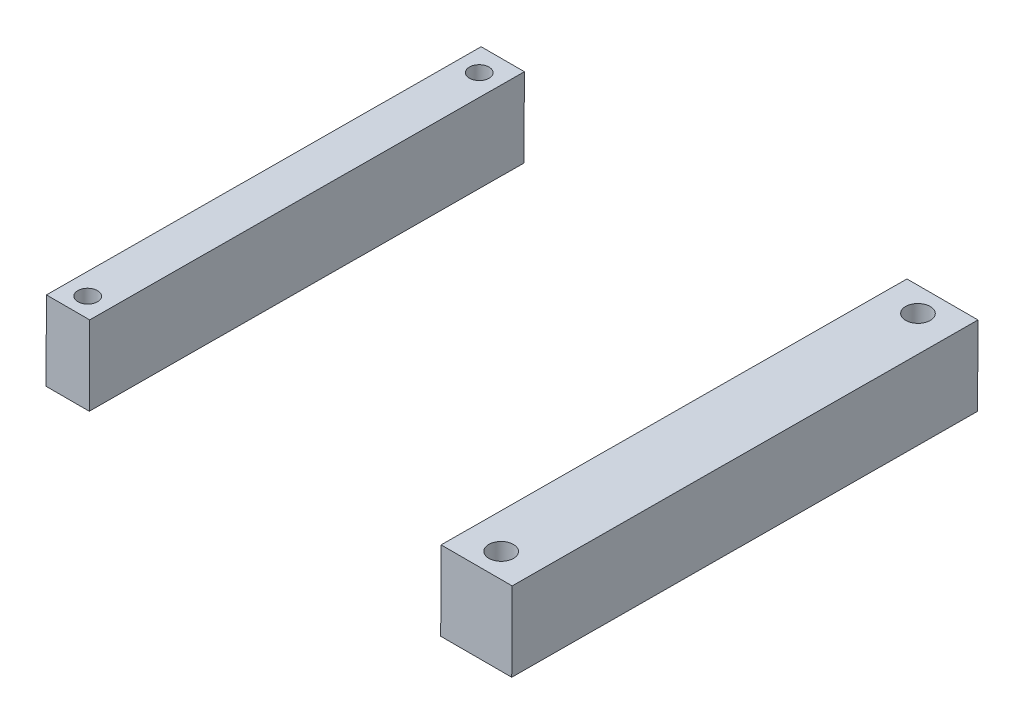
ISO-10303-21;
HEADER;
FILE_DESCRIPTION(('STEP AP214'),'2;1');
FILE_NAME('part.step','',(''),(''),'','','');
FILE_SCHEMA(('AUTOMOTIVE_DESIGN { 1 0 10303 214 1 1 1 1 }'));
ENDSEC;
DATA;
#1=APPLICATION_CONTEXT('core data for automotive mechanical design processes');
#2=APPLICATION_PROTOCOL_DEFINITION('international standard','automotive_design',2000,#1);
#3=PRODUCT_CONTEXT('',#1,'mechanical');
#4=PRODUCT('Part','Part','',(#3));
#5=PRODUCT_RELATED_PRODUCT_CATEGORY('part','',(#4));
#6=PRODUCT_DEFINITION_FORMATION('','',#4);
#7=PRODUCT_DEFINITION_CONTEXT('part definition',#1,'design');
#8=PRODUCT_DEFINITION('design','',#6,#7);
#9=PRODUCT_DEFINITION_SHAPE('','',#8);
#10=(LENGTH_UNIT() NAMED_UNIT(*) SI_UNIT(.MILLI.,.METRE.));
#11=(NAMED_UNIT(*) PLANE_ANGLE_UNIT() SI_UNIT($,.RADIAN.));
#12=(NAMED_UNIT(*) SI_UNIT($,.STERADIAN.) SOLID_ANGLE_UNIT());
#13=UNCERTAINTY_MEASURE_WITH_UNIT(LENGTH_MEASURE(1.E-05),#10,'distance_accuracy_value','');
#14=(GEOMETRIC_REPRESENTATION_CONTEXT(3) GLOBAL_UNCERTAINTY_ASSIGNED_CONTEXT((#13)) GLOBAL_UNIT_ASSIGNED_CONTEXT((#10,
#11,#12)) REPRESENTATION_CONTEXT('',''));
#15=CARTESIAN_POINT('',(0.,0.,0.));
#16=DIRECTION('',(0.,0.,1.));
#17=DIRECTION('',(1.,0.,0.));
#18=AXIS2_PLACEMENT_3D('',#15,#16,#17);
#19=CARTESIAN_POINT('',(0.,325.481791177383,-1.81138531546685));
#20=DIRECTION('',(0.,0.99998451439394,-0.0055651569893207));
#21=DIRECTION('',(0.,0.0055651569893207,0.99998451439394));
#22=AXIS2_PLACEMENT_3D('',#19,#20,#21);
#23=PLANE('',#22);
#24=CARTESIAN_POINT('',(-69.4999999998664,319.832234200687,-1016.96145219099));
#25=DIRECTION('',(0.,0.99998451439394,-0.00556515698932075));
#26=DIRECTION('',(0.,0.00556515698932075,0.99998451439394));
#27=AXIS2_PLACEMENT_3D('',#24,#25,#26);
#28=CIRCLE('',#27,3.17500000000019);
#29=CARTESIAN_POINT('',(-69.4999999998664,319.814564827246,-1020.13640302419));
#30=VERTEX_POINT('',#29);
#31=EDGE_CURVE('E118',#30,#30,#28,.T.);
#32=ORIENTED_EDGE('',*,*,#31,.F.);
#33=EDGE_LOOP('',(#32));
#34=FACE_BOUND('',#33,.T.);
#35=DIRECTION('',(0.,0.0055651569893207,0.99998451439394));
#36=VECTOR('',#35,1.);
#37=CARTESIAN_POINT('',(-76.4999999998666,319.789827704428,-1024.58133419067));
#38=LINE('',#37,#36);
#39=CARTESIAN_POINT('',(-76.4999999998666,319.789827704428,-1024.58133419067));
#40=VERTEX_POINT('',#39);
#41=CARTESIAN_POINT('',(-76.4999999998666,320.572998735481,-883.855941416111));
#42=VERTEX_POINT('',#41);
#43=EDGE_CURVE('E111',#40,#42,#38,.T.);
#44=ORIENTED_EDGE('',*,*,#43,.T.);
#45=DIRECTION('',(1.,0.,0.));
#46=VECTOR('',#45,1.);
#47=CARTESIAN_POINT('',(-76.4999999998666,320.572998735481,-883.855941416111));
#48=LINE('',#47,#46);
#49=CARTESIAN_POINT('',(-62.4999999998668,320.572998735481,-883.855941416111));
#50=VERTEX_POINT('',#49);
#51=EDGE_CURVE('E80',#42,#50,#48,.T.);
#52=ORIENTED_EDGE('',*,*,#51,.T.);
#53=DIRECTION('',(0.,-0.0055651569893207,-0.99998451439394));
#54=VECTOR('',#53,1.);
#55=CARTESIAN_POINT('',(-62.4999999998668,319.789827704428,-1024.58133419067));
#56=LINE('',#55,#54);
#57=CARTESIAN_POINT('',(-62.4999999998668,319.789827704428,-1024.58133419067));
#58=VERTEX_POINT('',#57);
#59=EDGE_CURVE('E120',#50,#58,#56,.T.);
#60=ORIENTED_EDGE('',*,*,#59,.T.);
#61=DIRECTION('',(-1.,0.,0.));
#62=VECTOR('',#61,1.);
#63=CARTESIAN_POINT('',(-76.4999999998666,319.789827704428,-1024.58133419067));
#64=LINE('',#63,#62);
#65=EDGE_CURVE('E104',#58,#40,#64,.T.);
#66=ORIENTED_EDGE('',*,*,#65,.T.);
#67=EDGE_LOOP('',(#44,#52,#60,#66));
#68=FACE_BOUND('',#67,.T.);
#69=CARTESIAN_POINT('',(-69.4999999998664,320.537659988599,-890.205843082512));
#70=DIRECTION('',(0.,0.99998451439394,-0.00556515698932075));
#71=DIRECTION('',(0.,0.00556515698932075,0.99998451439394));
#72=AXIS2_PLACEMENT_3D('',#69,#70,#71);
#73=CIRCLE('',#72,3.17500000000008);
#74=CARTESIAN_POINT('',(-69.4999999998664,320.519990615157,-893.380793915713));
#75=VERTEX_POINT('',#74);
#76=EDGE_CURVE('E51',#75,#75,#73,.T.);
#77=ORIENTED_EDGE('',*,*,#76,.F.);
#78=EDGE_LOOP('',(#77));
#79=FACE_BOUND('',#78,.T.);
#80=ADVANCED_FACE('F47',(#34,#68,#79),#23,.T.);
#81=CARTESIAN_POINT('',(0.,299.932186834617,-1.66919555438971));
#82=DIRECTION('',(0.,0.99998451439394,-0.0055651569893207));
#83=DIRECTION('',(0.,0.0055651569893207,0.99998451439394));
#84=AXIS2_PLACEMENT_3D('',#81,#82,#83);
#85=PLANE('',#84);
#86=DIRECTION('',(0.,0.0055651569893207,0.99998451439394));
#87=VECTOR('',#86,1.);
#88=CARTESIAN_POINT('',(-76.4999999998666,294.240223361663,-1024.43914442959));
#89=LINE('',#88,#87);
#90=CARTESIAN_POINT('',(-76.4999999998666,294.240223361663,-1024.43914442959));
#91=VERTEX_POINT('',#90);
#92=CARTESIAN_POINT('',(-76.4999999998666,295.023394392716,-883.713751655034));
#93=VERTEX_POINT('',#92);
#94=EDGE_CURVE('E110',#91,#93,#89,.T.);
#95=ORIENTED_EDGE('',*,*,#94,.F.);
#96=DIRECTION('',(-1.,0.,0.));
#97=VECTOR('',#96,1.);
#98=CARTESIAN_POINT('',(-76.4999999998666,294.240223361663,-1024.43914442959));
#99=LINE('',#98,#97);
#100=CARTESIAN_POINT('',(-62.4999999998668,294.240223361663,-1024.43914442959));
#101=VERTEX_POINT('',#100);
#102=EDGE_CURVE('E90',#101,#91,#99,.T.);
#103=ORIENTED_EDGE('',*,*,#102,.F.);
#104=DIRECTION('',(0.,-0.0055651569893207,-0.99998451439394));
#105=VECTOR('',#104,1.);
#106=CARTESIAN_POINT('',(-62.4999999998668,294.240223361663,-1024.43914442959));
#107=LINE('',#106,#105);
#108=CARTESIAN_POINT('',(-62.4999999998668,295.023394392716,-883.713751655034));
#109=VERTEX_POINT('',#108);
#110=EDGE_CURVE('E96',#109,#101,#107,.T.);
#111=ORIENTED_EDGE('',*,*,#110,.F.);
#112=DIRECTION('',(1.,0.,0.));
#113=VECTOR('',#112,1.);
#114=CARTESIAN_POINT('',(-76.4999999998666,295.023394392716,-883.713751655034));
#115=LINE('',#114,#113);
#116=EDGE_CURVE('E64',#93,#109,#115,.T.);
#117=ORIENTED_EDGE('',*,*,#116,.F.);
#118=EDGE_LOOP('',(#95,#103,#111,#117));
#119=FACE_BOUND('',#118,.T.);
#120=CARTESIAN_POINT('',(-69.4999999998664,294.282629857922,-1016.81926242991));
#121=DIRECTION('',(0.,0.99998451439394,-0.00556515698932075));
#122=DIRECTION('',(0.,0.00556515698932075,0.99998451439394));
#123=AXIS2_PLACEMENT_3D('',#120,#121,#122);
#124=CIRCLE('',#123,3.17500000000019);
#125=CARTESIAN_POINT('',(-69.4999999998664,294.264960484481,-1019.99421326311));
#126=VERTEX_POINT('',#125);
#127=EDGE_CURVE('E123',#126,#126,#124,.T.);
#128=ORIENTED_EDGE('',*,*,#127,.T.);
#129=EDGE_LOOP('',(#128));
#130=FACE_BOUND('',#129,.T.);
#131=CARTESIAN_POINT('',(-69.4999999998664,294.988055645833,-890.063653321435));
#132=DIRECTION('',(0.,0.99998451439394,-0.00556515698932075));
#133=DIRECTION('',(0.,0.00556515698932075,0.99998451439394));
#134=AXIS2_PLACEMENT_3D('',#131,#132,#133);
#135=CIRCLE('',#134,3.17500000000008);
#136=CARTESIAN_POINT('',(-69.4999999998664,294.970386272392,-893.238604154636));
#137=VERTEX_POINT('',#136);
#138=EDGE_CURVE('E12',#137,#137,#135,.T.);
#139=ORIENTED_EDGE('',*,*,#138,.T.);
#140=EDGE_LOOP('',(#139));
#141=FACE_BOUND('',#140,.T.);
#142=ADVANCED_FACE('F107',(#119,#130,#141),#85,.F.);
#143=CARTESIAN_POINT('',(-76.4999999998666,319.789827704428,-1024.58133419067));
#144=DIRECTION('',(1.,0.,0.));
#145=DIRECTION('',(0.,1.,0.));
#146=AXIS2_PLACEMENT_3D('',#143,#144,#145);
#147=PLANE('',#146);
#148=ORIENTED_EDGE('',*,*,#94,.T.);
#149=DIRECTION('',(0.,-0.99998451439394,0.00556515698932075));
#150=VECTOR('',#149,1.);
#151=CARTESIAN_POINT('',(-76.4999999998666,320.572998735481,-883.855941416111));
#152=LINE('',#151,#150);
#153=EDGE_CURVE('E168',#42,#93,#152,.T.);
#154=ORIENTED_EDGE('',*,*,#153,.F.);
#155=ORIENTED_EDGE('',*,*,#43,.F.);
#156=DIRECTION('',(0.,-0.99998451439394,0.00556515698932075));
#157=VECTOR('',#156,1.);
#158=CARTESIAN_POINT('',(-76.4999999998666,319.789827704428,-1024.58133419067));
#159=LINE('',#158,#157);
#160=EDGE_CURVE('E105',#40,#91,#159,.T.);
#161=ORIENTED_EDGE('',*,*,#160,.T.);
#162=EDGE_LOOP('',(#148,#154,#155,#161));
#163=FACE_BOUND('',#162,.T.);
#164=ADVANCED_FACE('F145',(#163),#147,.F.);
#165=CARTESIAN_POINT('',(-76.4999999998666,320.572998735481,-883.855941416111));
#166=DIRECTION('',(0.,-0.00556515698932075,-0.99998451439394));
#167=DIRECTION('',(0.,0.99998451439394,-0.00556515698932075));
#168=AXIS2_PLACEMENT_3D('',#165,#166,#167);
#169=PLANE('',#168);
#170=ORIENTED_EDGE('',*,*,#116,.T.);
#171=DIRECTION('',(0.,-0.99998451439394,0.00556515698932075));
#172=VECTOR('',#171,1.);
#173=CARTESIAN_POINT('',(-62.4999999998668,320.572998735481,-883.855941416111));
#174=LINE('',#173,#172);
#175=EDGE_CURVE('E101',#50,#109,#174,.T.);
#176=ORIENTED_EDGE('',*,*,#175,.F.);
#177=ORIENTED_EDGE('',*,*,#51,.F.);
#178=ORIENTED_EDGE('',*,*,#153,.T.);
#179=EDGE_LOOP('',(#170,#176,#177,#178));
#180=FACE_BOUND('',#179,.T.);
#181=ADVANCED_FACE('F150',(#180),#169,.F.);
#182=CARTESIAN_POINT('',(-62.4999999998668,319.789827704428,-1024.58133419067));
#183=DIRECTION('',(-1.,0.,0.));
#184=DIRECTION('',(0.,-1.,0.));
#185=AXIS2_PLACEMENT_3D('',#182,#183,#184);
#186=PLANE('',#185);
#187=ORIENTED_EDGE('',*,*,#110,.T.);
#188=DIRECTION('',(0.,-0.99998451439394,0.00556515698932075));
#189=VECTOR('',#188,1.);
#190=CARTESIAN_POINT('',(-62.4999999998668,319.789827704428,-1024.58133419067));
#191=LINE('',#190,#189);
#192=EDGE_CURVE('E99',#58,#101,#191,.T.);
#193=ORIENTED_EDGE('',*,*,#192,.F.);
#194=ORIENTED_EDGE('',*,*,#59,.F.);
#195=ORIENTED_EDGE('',*,*,#175,.T.);
#196=EDGE_LOOP('',(#187,#193,#194,#195));
#197=FACE_BOUND('',#196,.T.);
#198=ADVANCED_FACE('F97',(#197),#186,.F.);
#199=CARTESIAN_POINT('',(-76.4999999998666,319.789827704428,-1024.58133419067));
#200=DIRECTION('',(0.,0.00556515698932075,0.99998451439394));
#201=DIRECTION('',(0.,-0.99998451439394,0.00556515698932075));
#202=AXIS2_PLACEMENT_3D('',#199,#200,#201);
#203=PLANE('',#202);
#204=ORIENTED_EDGE('',*,*,#102,.T.);
#205=ORIENTED_EDGE('',*,*,#160,.F.);
#206=ORIENTED_EDGE('',*,*,#65,.F.);
#207=ORIENTED_EDGE('',*,*,#192,.T.);
#208=EDGE_LOOP('',(#204,#205,#206,#207));
#209=FACE_BOUND('',#208,.T.);
#210=ADVANCED_FACE('F103',(#209),#203,.F.);
#211=CARTESIAN_POINT('',(-69.4999999998664,319.832234200687,-1016.96145219099));
#212=DIRECTION('',(0.,-0.99998451439394,0.00556515698932075));
#213=DIRECTION('',(0.,-0.00556515698932075,-0.99998451439394));
#214=AXIS2_PLACEMENT_3D('',#211,#212,#213);
#215=CYLINDRICAL_SURFACE('',#214,3.17500000000019);
#216=CARTESIAN_POINT('',(-69.4999999998664,319.814564827246,-1020.13640302419));
#217=CARTESIAN_POINT('',(-69.4999999998664,319.548423115342,-1020.13492188084));
#218=CARTESIAN_POINT('',(-69.4999999998664,319.282281403438,-1020.1334407375));
#219=CARTESIAN_POINT('',(-69.4999999998664,318.749997979631,-1020.13047845081));
#220=CARTESIAN_POINT('',(-69.4999999998664,318.483856267727,-1020.12899730747));
#221=CARTESIAN_POINT('',(-69.4999999998664,317.951572843919,-1020.12603502078));
#222=CARTESIAN_POINT('',(-69.4999999998664,317.685431132016,-1020.12455387743));
#223=CARTESIAN_POINT('',(-69.4999999998664,317.153147708208,-1020.12159159074));
#224=CARTESIAN_POINT('',(-69.4999999998664,316.887005996304,-1020.1201104474));
#225=CARTESIAN_POINT('',(-69.4999999998664,316.354722572497,-1020.11714816071));
#226=CARTESIAN_POINT('',(-69.4999999998664,316.088580860593,-1020.11566701736));
#227=CARTESIAN_POINT('',(-69.4999999998664,315.556297436785,-1020.11270473068));
#228=CARTESIAN_POINT('',(-69.4999999998664,315.290155724881,-1020.11122358733));
#229=CARTESIAN_POINT('',(-69.4999999998664,314.757872301074,-1020.10826130064));
#230=CARTESIAN_POINT('',(-69.4999999998664,314.49173058917,-1020.1067801573));
#231=CARTESIAN_POINT('',(-69.4999999998664,313.959447165362,-1020.10381787061));
#232=CARTESIAN_POINT('',(-69.4999999998664,313.693305453459,-1020.10233672726));
#233=CARTESIAN_POINT('',(-69.4999999998664,313.161022029651,-1020.09937444057));
#234=CARTESIAN_POINT('',(-69.4999999998664,312.894880317747,-1020.09789329723));
#235=CARTESIAN_POINT('',(-69.4999999998664,312.362596893939,-1020.09493101054));
#236=CARTESIAN_POINT('',(-69.4999999998664,312.096455182036,-1020.0934498672));
#237=CARTESIAN_POINT('',(-69.4999999998664,311.564171758228,-1020.09048758051));
#238=CARTESIAN_POINT('',(-69.4999999998664,311.298030046324,-1020.08900643716));
#239=CARTESIAN_POINT('',(-69.4999999998664,310.765746622517,-1020.08604415047));
#240=CARTESIAN_POINT('',(-69.4999999998664,310.499604910613,-1020.08456300713));
#241=CARTESIAN_POINT('',(-69.4999999998664,309.967321486805,-1020.08160072044));
#242=CARTESIAN_POINT('',(-69.4999999998664,309.701179774901,-1020.0801195771));
#243=CARTESIAN_POINT('',(-69.4999999998664,309.168896351094,-1020.07715729041));
#244=CARTESIAN_POINT('',(-69.4999999998664,308.90275463919,-1020.07567614706));
#245=CARTESIAN_POINT('',(-69.4999999998664,308.370471215382,-1020.07271386037));
#246=CARTESIAN_POINT('',(-69.4999999998664,308.104329503479,-1020.07123271703));
#247=CARTESIAN_POINT('',(-69.4999999998664,307.572046079671,-1020.06827043034));
#248=CARTESIAN_POINT('',(-69.4999999998664,307.305904367767,-1020.06678928699));
#249=CARTESIAN_POINT('',(-69.4999999998664,306.77362094396,-1020.06382700031));
#250=CARTESIAN_POINT('',(-69.4999999998664,306.507479232056,-1020.06234585696));
#251=CARTESIAN_POINT('',(-69.4999999998664,305.975195808248,-1020.05938357027));
#252=CARTESIAN_POINT('',(-69.4999999998664,305.709054096344,-1020.05790242693));
#253=CARTESIAN_POINT('',(-69.4999999998664,305.176770672537,-1020.05494014024));
#254=CARTESIAN_POINT('',(-69.4999999998664,304.910628960633,-1020.05345899689));
#255=CARTESIAN_POINT('',(-69.4999999998664,304.378345536825,-1020.0504967102));
#256=CARTESIAN_POINT('',(-69.4999999998664,304.112203824922,-1020.04901556686));
#257=CARTESIAN_POINT('',(-69.4999999998664,303.579920401114,-1020.04605328017));
#258=CARTESIAN_POINT('',(-69.4999999998664,303.31377868921,-1020.04457213683));
#259=CARTESIAN_POINT('',(-69.4999999998664,302.781495265403,-1020.04160985014));
#260=CARTESIAN_POINT('',(-69.4999999998664,302.515353553499,-1020.04012870679));
#261=CARTESIAN_POINT('',(-69.4999999998664,301.983070129691,-1020.0371664201));
#262=CARTESIAN_POINT('',(-69.4999999998664,301.716928417787,-1020.03568527676));
#263=CARTESIAN_POINT('',(-69.4999999998664,301.18464499398,-1020.03272299007));
#264=CARTESIAN_POINT('',(-69.4999999998664,300.918503282076,-1020.03124184673));
#265=CARTESIAN_POINT('',(-69.4999999998664,300.386219858268,-1020.02827956004));
#266=CARTESIAN_POINT('',(-69.4999999998664,300.120078146365,-1020.02679841669));
#267=CARTESIAN_POINT('',(-69.4999999998664,299.587794722557,-1020.02383613));
#268=CARTESIAN_POINT('',(-69.4999999998664,299.321653010653,-1020.02235498666));
#269=CARTESIAN_POINT('',(-69.4999999998664,298.789369586846,-1020.01939269997));
#270=CARTESIAN_POINT('',(-69.4999999998664,298.523227874942,-1020.01791155662));
#271=CARTESIAN_POINT('',(-69.4999999998664,297.990944451134,-1020.01494926993));
#272=CARTESIAN_POINT('',(-69.4999999998664,297.72480273923,-1020.01346812659));
#273=CARTESIAN_POINT('',(-69.4999999998664,297.192519315423,-1020.0105058399));
#274=CARTESIAN_POINT('',(-69.4999999998664,296.926377603519,-1020.00902469656));
#275=CARTESIAN_POINT('',(-69.4999999998664,296.394094179711,-1020.00606240987));
#276=CARTESIAN_POINT('',(-69.4999999998664,296.127952467807,-1020.00458126652));
#277=CARTESIAN_POINT('',(-69.4999999998664,295.595669044,-1020.00161897983));
#278=CARTESIAN_POINT('',(-69.4999999998664,295.329527332096,-1020.00013783649));
#279=CARTESIAN_POINT('',(-69.4999999998664,294.797243908288,-1019.9971755498));
#280=CARTESIAN_POINT('',(-69.4999999998664,294.531102196385,-1019.99569440646));
#281=CARTESIAN_POINT('',(-69.4999999998664,294.264960484481,-1019.99421326311));
#282=B_SPLINE_CURVE_WITH_KNOTS('',3,(#216,#217,#218,#219,#220,#221,#222,#223,#224,#225,#226,
#227,#228,#229,#230,#231,#232,#233,#234,#235,#236,#237,#238,#239,#240,#241,#242,#243,#244,#245,
#246,#247,#248,#249,#250,#251,#252,#253,#254,#255,#256,#257,#258,#259,#260,#261,#262,#263,#264,
#265,#266,#267,#268,#269,#270,#271,#272,#273,#274,#275,#276,#277,#278,#279,#280,#281),
.UNSPECIFIED.,.F.,.F.,(4,2,2,2,2,2,2,2,2,2,2,2,2,2,2,2,2,2,2,2,2,2,2,2,2,2,2,2,2,2,2,2,4),(0.,
0.798437499999967,1.59687499999999,2.39531249999996,3.19374999999998,3.99218749999994,
4.79062499999997,5.58906249999999,6.38749999999995,7.18593749999998,7.98437499999994,
8.78281249999997,9.58124999999999,10.3796875,11.178125,11.9765624999999,12.775,13.5734375,
14.371875,15.1703125,15.9687499999999,16.7671875,17.565625,18.3640625,19.1625,19.9609375,
20.759375,21.5578124999999,22.35625,23.1546875,23.953125,24.7515625,25.5499999999999),.UNSPECIFIED.);
#283=EDGE_CURVE('BSEAM129',#30,#126,#282,.T.);
#284=ORIENTED_EDGE('',*,*,#31,.T.);
#285=ORIENTED_EDGE('',*,*,#127,.F.);
#286=ORIENTED_EDGE('',*,*,#283,.T.);
#287=ORIENTED_EDGE('',*,*,#283,.F.);
#288=EDGE_LOOP('',(#284,#286,#285,#287));
#289=FACE_BOUND('',#288,.T.);
#290=ADVANCED_FACE('F129',(#289),#215,.F.);
#291=CARTESIAN_POINT('',(-69.4999999998664,320.537659988599,-890.205843082512));
#292=DIRECTION('',(0.,-0.99998451439394,0.00556515698932075));
#293=DIRECTION('',(0.,-0.00556515698932075,-0.99998451439394));
#294=AXIS2_PLACEMENT_3D('',#291,#292,#293);
#295=CYLINDRICAL_SURFACE('',#294,3.17500000000008);
#296=CARTESIAN_POINT('',(-69.4999999998664,320.519990615157,-893.380793915713));
#297=CARTESIAN_POINT('',(-69.4999999998664,320.253848903254,-893.379312772369));
#298=CARTESIAN_POINT('',(-69.4999999998664,319.98770719135,-893.377831629024));
#299=CARTESIAN_POINT('',(-69.4999999998664,319.455423767542,-893.374869342335));
#300=CARTESIAN_POINT('',(-69.4999999998664,319.189282055638,-893.37338819899));
#301=CARTESIAN_POINT('',(-69.4999999998664,318.656998631831,-893.370425912301));
#302=CARTESIAN_POINT('',(-69.4999999998664,318.390856919927,-893.368944768957));
#303=CARTESIAN_POINT('',(-69.4999999998664,317.858573496119,-893.365982482268));
#304=CARTESIAN_POINT('',(-69.4999999998664,317.592431784216,-893.364501338923));
#305=CARTESIAN_POINT('',(-69.4999999998664,317.060148360408,-893.361539052234));
#306=CARTESIAN_POINT('',(-69.4999999998664,316.794006648504,-893.36005790889));
#307=CARTESIAN_POINT('',(-69.4999999998664,316.261723224697,-893.3570956222));
#308=CARTESIAN_POINT('',(-69.4999999998664,315.995581512793,-893.355614478856));
#309=CARTESIAN_POINT('',(-69.4999999998664,315.463298088985,-893.352652192167));
#310=CARTESIAN_POINT('',(-69.4999999998664,315.197156377081,-893.351171048822));
#311=CARTESIAN_POINT('',(-69.4999999998664,314.664872953274,-893.348208762133));
#312=CARTESIAN_POINT('',(-69.4999999998664,314.39873124137,-893.346727618789));
#313=CARTESIAN_POINT('',(-69.4999999998664,313.866447817562,-893.343765332099));
#314=CARTESIAN_POINT('',(-69.4999999998664,313.600306105659,-893.342284188755));
#315=CARTESIAN_POINT('',(-69.4999999998664,313.068022681851,-893.339321902066));
#316=CARTESIAN_POINT('',(-69.4999999998664,312.801880969947,-893.337840758721));
#317=CARTESIAN_POINT('',(-69.4999999998664,312.26959754614,-893.334878472032));
#318=CARTESIAN_POINT('',(-69.4999999998664,312.003455834236,-893.333397328687));
#319=CARTESIAN_POINT('',(-69.4999999998664,311.471172410428,-893.330435041998));
#320=CARTESIAN_POINT('',(-69.4999999998664,311.205030698524,-893.328953898654));
#321=CARTESIAN_POINT('',(-69.4999999998664,310.672747274717,-893.325991611965));
#322=CARTESIAN_POINT('',(-69.4999999998664,310.406605562813,-893.32451046862));
#323=CARTESIAN_POINT('',(-69.4999999998664,309.874322139005,-893.321548181931));
#324=CARTESIAN_POINT('',(-69.4999999998664,309.608180427102,-893.320067038586));
#325=CARTESIAN_POINT('',(-69.4999999998664,309.075897003294,-893.317104751897));
#326=CARTESIAN_POINT('',(-69.4999999998664,308.80975529139,-893.315623608553));
#327=CARTESIAN_POINT('',(-69.4999999998664,308.277471867583,-893.312661321864));
#328=CARTESIAN_POINT('',(-69.4999999998664,308.011330155679,-893.311180178519));
#329=CARTESIAN_POINT('',(-69.4999999998664,307.479046731871,-893.30821789183));
#330=CARTESIAN_POINT('',(-69.4999999998664,307.212905019967,-893.306736748485));
#331=CARTESIAN_POINT('',(-69.4999999998664,306.68062159616,-893.303774461796));
#332=CARTESIAN_POINT('',(-69.4999999998664,306.414479884256,-893.302293318452));
#333=CARTESIAN_POINT('',(-69.4999999998664,305.882196460448,-893.299331031763));
#334=CARTESIAN_POINT('',(-69.4999999998664,305.616054748544,-893.297849888418));
#335=CARTESIAN_POINT('',(-69.4999999998664,305.083771324737,-893.294887601729));
#336=CARTESIAN_POINT('',(-69.4999999998664,304.817629612833,-893.293406458385));
#337=CARTESIAN_POINT('',(-69.4999999998664,304.285346189025,-893.290444171695));
#338=CARTESIAN_POINT('',(-69.4999999998664,304.019204477122,-893.288963028351));
#339=CARTESIAN_POINT('',(-69.4999999998664,303.486921053314,-893.286000741662));
#340=CARTESIAN_POINT('',(-69.4999999998664,303.22077934141,-893.284519598317));
#341=CARTESIAN_POINT('',(-69.4999999998664,302.688495917603,-893.281557311628));
#342=CARTESIAN_POINT('',(-69.4999999998664,302.422354205699,-893.280076168284));
#343=CARTESIAN_POINT('',(-69.4999999998664,301.890070781891,-893.277113881594));
#344=CARTESIAN_POINT('',(-69.4999999998664,301.623929069987,-893.27563273825));
#345=CARTESIAN_POINT('',(-69.4999999998664,301.09164564618,-893.272670451561));
#346=CARTESIAN_POINT('',(-69.4999999998664,300.825503934276,-893.271189308216));
#347=CARTESIAN_POINT('',(-69.4999999998664,300.293220510468,-893.268227021527));
#348=CARTESIAN_POINT('',(-69.4999999998664,300.027078798565,-893.266745878183));
#349=CARTESIAN_POINT('',(-69.4999999998664,299.494795374757,-893.263783591494));
#350=CARTESIAN_POINT('',(-69.4999999998664,299.228653662853,-893.262302448149));
#351=CARTESIAN_POINT('',(-69.4999999998664,298.696370239046,-893.25934016146));
#352=CARTESIAN_POINT('',(-69.4999999998664,298.430228527142,-893.257859018115));
#353=CARTESIAN_POINT('',(-69.4999999998664,297.897945103334,-893.254896731426));
#354=CARTESIAN_POINT('',(-69.4999999998664,297.63180339143,-893.253415588082));
#355=CARTESIAN_POINT('',(-69.4999999998664,297.099519967623,-893.250453301393));
#356=CARTESIAN_POINT('',(-69.4999999998664,296.833378255719,-893.248972158048));
#357=CARTESIAN_POINT('',(-69.4999999998664,296.301094831911,-893.246009871359));
#358=CARTESIAN_POINT('',(-69.4999999998664,296.034953120008,-893.244528728014));
#359=CARTESIAN_POINT('',(-69.4999999998664,295.5026696962,-893.241566441325));
#360=CARTESIAN_POINT('',(-69.4999999998664,295.236527984296,-893.240085297981));
#361=CARTESIAN_POINT('',(-69.4999999998664,294.970386272392,-893.238604154636));
#362=B_SPLINE_CURVE_WITH_KNOTS('',3,(#296,#297,#298,#299,#300,#301,#302,#303,#304,#305,#306,
#307,#308,#309,#310,#311,#312,#313,#314,#315,#316,#317,#318,#319,#320,#321,#322,#323,#324,#325,
#326,#327,#328,#329,#330,#331,#332,#333,#334,#335,#336,#337,#338,#339,#340,#341,#342,#343,#344,
#345,#346,#347,#348,#349,#350,#351,#352,#353,#354,#355,#356,#357,#358,#359,#360,#361),
.UNSPECIFIED.,.F.,.F.,(4,2,2,2,2,2,2,2,2,2,2,2,2,2,2,2,2,2,2,2,2,2,2,2,2,2,2,2,2,2,2,2,4),(0.,
0.798437499999967,1.59687499999999,2.39531249999995,3.19374999999998,3.99218749999994,
4.79062499999996,5.58906249999999,6.38749999999995,7.18593749999998,7.98437499999994,
8.78281249999997,9.58124999999999,10.3796875,11.178125,11.9765624999999,12.775,13.5734375,
14.371875,15.1703125,15.9687499999999,16.7671875,17.565625,18.3640625,19.1625,19.9609374999999,
20.759375,21.5578125,22.35625,23.1546875,23.953125,24.7515625,25.55),.UNSPECIFIED.);
#363=EDGE_CURVE('BSEAM49',#75,#137,#362,.T.);
#364=ORIENTED_EDGE('',*,*,#76,.T.);
#365=ORIENTED_EDGE('',*,*,#138,.F.);
#366=ORIENTED_EDGE('',*,*,#363,.T.);
#367=ORIENTED_EDGE('',*,*,#363,.F.);
#368=EDGE_LOOP('',(#364,#366,#365,#367));
#369=FACE_BOUND('',#368,.T.);
#370=ADVANCED_FACE('F49',(#369),#295,.F.);
#371=CLOSED_SHELL('',(#80,#142,#164,#181,#198,#210,#290,#370));
#372=MANIFOLD_SOLID_BREP('B2',#371);
#373=CARTESIAN_POINT('',(0.,325.481791177382,-1.81138531546679));
#374=DIRECTION('',(0.,0.99998451439394,-0.00556515698932049));
#375=DIRECTION('',(0.,0.00556515698932048,0.99998451439394));
#376=AXIS2_PLACEMENT_3D('',#373,#374,#375);
#377=PLANE('',#376);
#378=CARTESIAN_POINT('',(69.0000000001624,320.563509741976,-885.560987038338));
#379=DIRECTION('',(0.,0.99998451439394,-0.00556515698932075));
#380=DIRECTION('',(0.,0.00556515698932075,0.99998451439394));
#381=AXIS2_PLACEMENT_3D('',#378,#379,#380);
#382=CIRCLE('',#381,3.96874999999998);
#383=CARTESIAN_POINT('',(69.0000000001624,320.541423025175,-889.529675579839));
#384=VERTEX_POINT('',#383);
#385=EDGE_CURVE('E296',#384,#384,#382,.T.);
#386=ORIENTED_EDGE('',*,*,#385,.F.);
#387=EDGE_LOOP('',(#386));
#388=FACE_BOUND('',#387,.T.);
#389=DIRECTION('',(0.,0.00556515698932048,0.99998451439394));
#390=VECTOR('',#389,1.);
#391=CARTESIAN_POINT('',(57.5000000001624,319.76845750159,-1028.42127472594));
#392=LINE('',#391,#390);
#393=CARTESIAN_POINT('',(57.5000000001624,319.76845750159,-1028.42127472594));
#394=VERTEX_POINT('',#393);
#395=CARTESIAN_POINT('',(57.5000000001624,320.607683175579,-877.623609955336));
#396=VERTEX_POINT('',#395);
#397=EDGE_CURVE('E281',#394,#396,#392,.T.);
#398=ORIENTED_EDGE('',*,*,#397,.T.);
#399=DIRECTION('',(1.,0.,0.));
#400=VECTOR('',#399,1.);
#401=CARTESIAN_POINT('',(57.5000000001624,320.607683175579,-877.623609955336));
#402=LINE('',#401,#400);
#403=CARTESIAN_POINT('',(80.5000000001624,320.607683175579,-877.623609955336));
#404=VERTEX_POINT('',#403);
#405=EDGE_CURVE('E276',#396,#404,#402,.T.);
#406=ORIENTED_EDGE('',*,*,#405,.T.);
#407=DIRECTION('',(0.,-0.00556515698932048,-0.99998451439394));
#408=VECTOR('',#407,1.);
#409=CARTESIAN_POINT('',(80.5000000001624,319.76845750159,-1028.42127472594));
#410=LINE('',#409,#408);
#411=CARTESIAN_POINT('',(80.5000000001624,319.76845750159,-1028.42127472594));
#412=VERTEX_POINT('',#411);
#413=EDGE_CURVE('E279',#404,#412,#410,.T.);
#414=ORIENTED_EDGE('',*,*,#413,.T.);
#415=DIRECTION('',(-1.,0.,0.));
#416=VECTOR('',#415,1.);
#417=CARTESIAN_POINT('',(57.5000000001624,319.76845750159,-1028.42127472594));
#418=LINE('',#417,#416);
#419=EDGE_CURVE('E246',#412,#394,#418,.T.);
#420=ORIENTED_EDGE('',*,*,#419,.T.);
#421=EDGE_LOOP('',(#398,#406,#414,#420));
#422=FACE_BOUND('',#421,.T.);
#423=CARTESIAN_POINT('',(69.0000000001625,319.812630935192,-1020.48389764294));
#424=DIRECTION('',(0.,0.99998451439394,-0.00556515698932075));
#425=DIRECTION('',(0.,0.00556515698932075,0.99998451439394));
#426=AXIS2_PLACEMENT_3D('',#423,#424,#425);
#427=CIRCLE('',#426,3.96875000000006);
#428=CARTESIAN_POINT('',(69.0000000001625,319.790544218391,-1024.45258618444));
#429=VERTEX_POINT('',#428);
#430=EDGE_CURVE('E311',#429,#429,#427,.T.);
#431=ORIENTED_EDGE('',*,*,#430,.F.);
#432=EDGE_LOOP('',(#431));
#433=FACE_BOUND('',#432,.T.);
#434=ADVANCED_FACE('F229',(#388,#422,#433),#377,.T.);
#435=CARTESIAN_POINT('',(0.,299.932186834617,-1.66919555438964));
#436=DIRECTION('',(0.,0.99998451439394,-0.00556515698932049));
#437=DIRECTION('',(0.,0.00556515698932048,0.99998451439394));
#438=AXIS2_PLACEMENT_3D('',#435,#436,#437);
#439=PLANE('',#438);
#440=DIRECTION('',(0.,0.00556515698932048,0.99998451439394));
#441=VECTOR('',#440,1.);
#442=CARTESIAN_POINT('',(57.5000000001624,294.218853158824,-1028.27908496486));
#443=LINE('',#442,#441);
#444=CARTESIAN_POINT('',(57.5000000001624,294.218853158824,-1028.27908496486));
#445=VERTEX_POINT('',#444);
#446=CARTESIAN_POINT('',(57.5000000001624,295.058078832814,-877.481420194259));
#447=VERTEX_POINT('',#446);
#448=EDGE_CURVE('E293',#445,#447,#443,.T.);
#449=ORIENTED_EDGE('',*,*,#448,.F.);
#450=DIRECTION('',(-1.,0.,0.));
#451=VECTOR('',#450,1.);
#452=CARTESIAN_POINT('',(57.5000000001624,294.218853158824,-1028.27908496486));
#453=LINE('',#452,#451);
#454=CARTESIAN_POINT('',(80.5000000001624,294.218853158824,-1028.27908496486));
#455=VERTEX_POINT('',#454);
#456=EDGE_CURVE('E269',#455,#445,#453,.T.);
#457=ORIENTED_EDGE('',*,*,#456,.F.);
#458=DIRECTION('',(0.,-0.00556515698932048,-0.99998451439394));
#459=VECTOR('',#458,1.);
#460=CARTESIAN_POINT('',(80.5000000001624,294.218853158824,-1028.27908496486));
#461=LINE('',#460,#459);
#462=CARTESIAN_POINT('',(80.5000000001624,295.058078832814,-877.481420194259));
#463=VERTEX_POINT('',#462);
#464=EDGE_CURVE('E263',#463,#455,#461,.T.);
#465=ORIENTED_EDGE('',*,*,#464,.F.);
#466=DIRECTION('',(1.,0.,0.));
#467=VECTOR('',#466,1.);
#468=CARTESIAN_POINT('',(57.5000000001624,295.058078832814,-877.481420194259));
#469=LINE('',#468,#467);
#470=EDGE_CURVE('E285',#447,#463,#469,.T.);
#471=ORIENTED_EDGE('',*,*,#470,.F.);
#472=EDGE_LOOP('',(#449,#457,#465,#471));
#473=FACE_BOUND('',#472,.T.);
#474=CARTESIAN_POINT('',(69.0000000001624,295.013905399211,-885.418797277261));
#475=DIRECTION('',(0.,0.99998451439394,-0.00556515698932075));
#476=DIRECTION('',(0.,0.00556515698932075,0.99998451439394));
#477=AXIS2_PLACEMENT_3D('',#474,#475,#476);
#478=CIRCLE('',#477,3.96874999999998);
#479=CARTESIAN_POINT('',(69.0000000001624,294.99181868241,-889.387485818761));
#480=VERTEX_POINT('',#479);
#481=EDGE_CURVE('E308',#480,#480,#478,.T.);
#482=ORIENTED_EDGE('',*,*,#481,.T.);
#483=EDGE_LOOP('',(#482));
#484=FACE_BOUND('',#483,.T.);
#485=CARTESIAN_POINT('',(69.0000000001625,294.263026592427,-1020.34170788186));
#486=DIRECTION('',(0.,0.99998451439394,-0.00556515698932075));
#487=DIRECTION('',(0.,0.00556515698932075,0.99998451439394));
#488=AXIS2_PLACEMENT_3D('',#485,#486,#487);
#489=CIRCLE('',#488,3.96875000000006);
#490=CARTESIAN_POINT('',(69.0000000001625,294.240939875626,-1024.31039642336));
#491=VERTEX_POINT('',#490);
#492=EDGE_CURVE('E314',#491,#491,#489,.T.);
#493=ORIENTED_EDGE('',*,*,#492,.T.);
#494=EDGE_LOOP('',(#493));
#495=FACE_BOUND('',#494,.T.);
#496=ADVANCED_FACE('F304',(#473,#484,#495),#439,.F.);
#497=CARTESIAN_POINT('',(57.5000000001624,319.76845750159,-1028.42127472594));
#498=DIRECTION('',(1.,0.,0.));
#499=DIRECTION('',(0.,1.,0.));
#500=AXIS2_PLACEMENT_3D('',#497,#498,#499);
#501=PLANE('',#500);
#502=ORIENTED_EDGE('',*,*,#448,.T.);
#503=DIRECTION('',(0.,-0.99998451439394,0.00556515698932075));
#504=VECTOR('',#503,1.);
#505=CARTESIAN_POINT('',(57.5000000001624,320.607683175579,-877.623609955336));
#506=LINE('',#505,#504);
#507=EDGE_CURVE('E45',#396,#447,#506,.T.);
#508=ORIENTED_EDGE('',*,*,#507,.F.);
#509=ORIENTED_EDGE('',*,*,#397,.F.);
#510=DIRECTION('',(0.,-0.99998451439394,0.00556515698932075));
#511=VECTOR('',#510,1.);
#512=CARTESIAN_POINT('',(57.5000000001624,319.76845750159,-1028.42127472594));
#513=LINE('',#512,#511);
#514=EDGE_CURVE('E289',#394,#445,#513,.T.);
#515=ORIENTED_EDGE('',*,*,#514,.T.);
#516=EDGE_LOOP('',(#502,#508,#509,#515));
#517=FACE_BOUND('',#516,.T.);
#518=ADVANCED_FACE('F231',(#517),#501,.F.);
#519=CARTESIAN_POINT('',(57.5000000001624,320.607683175579,-877.623609955336));
#520=DIRECTION('',(0.,-0.00556515698932075,-0.99998451439394));
#521=DIRECTION('',(0.,0.99998451439394,-0.00556515698932075));
#522=AXIS2_PLACEMENT_3D('',#519,#520,#521);
#523=PLANE('',#522);
#524=ORIENTED_EDGE('',*,*,#470,.T.);
#525=DIRECTION('',(0.,-0.99998451439394,0.00556515698932075));
#526=VECTOR('',#525,1.);
#527=CARTESIAN_POINT('',(80.5000000001624,320.607683175579,-877.623609955336));
#528=LINE('',#527,#526);
#529=EDGE_CURVE('E238',#404,#463,#528,.T.);
#530=ORIENTED_EDGE('',*,*,#529,.F.);
#531=ORIENTED_EDGE('',*,*,#405,.F.);
#532=ORIENTED_EDGE('',*,*,#507,.T.);
#533=EDGE_LOOP('',(#524,#530,#531,#532));
#534=FACE_BOUND('',#533,.T.);
#535=ADVANCED_FACE('F284',(#534),#523,.F.);
#536=CARTESIAN_POINT('',(80.5000000001624,319.76845750159,-1028.42127472594));
#537=DIRECTION('',(-1.,0.,0.));
#538=DIRECTION('',(0.,-1.,0.));
#539=AXIS2_PLACEMENT_3D('',#536,#537,#538);
#540=PLANE('',#539);
#541=ORIENTED_EDGE('',*,*,#464,.T.);
#542=DIRECTION('',(0.,-0.99998451439394,0.00556515698932075));
#543=VECTOR('',#542,1.);
#544=CARTESIAN_POINT('',(80.5000000001624,319.76845750159,-1028.42127472594));
#545=LINE('',#544,#543);
#546=EDGE_CURVE('E286',#412,#455,#545,.T.);
#547=ORIENTED_EDGE('',*,*,#546,.F.);
#548=ORIENTED_EDGE('',*,*,#413,.F.);
#549=ORIENTED_EDGE('',*,*,#529,.T.);
#550=EDGE_LOOP('',(#541,#547,#548,#549));
#551=FACE_BOUND('',#550,.T.);
#552=ADVANCED_FACE('F287',(#551),#540,.F.);
#553=CARTESIAN_POINT('',(57.5000000001624,319.76845750159,-1028.42127472594));
#554=DIRECTION('',(0.,0.00556515698932075,0.99998451439394));
#555=DIRECTION('',(0.,-0.99998451439394,0.00556515698932075));
#556=AXIS2_PLACEMENT_3D('',#553,#554,#555);
#557=PLANE('',#556);
#558=ORIENTED_EDGE('',*,*,#456,.T.);
#559=ORIENTED_EDGE('',*,*,#514,.F.);
#560=ORIENTED_EDGE('',*,*,#419,.F.);
#561=ORIENTED_EDGE('',*,*,#546,.T.);
#562=EDGE_LOOP('',(#558,#559,#560,#561));
#563=FACE_BOUND('',#562,.T.);
#564=ADVANCED_FACE('F301',(#563),#557,.F.);
#565=CARTESIAN_POINT('',(69.0000000001624,320.563509741976,-885.560987038338));
#566=DIRECTION('',(0.,-0.99998451439394,0.00556515698932075));
#567=DIRECTION('',(0.,-0.00556515698932075,-0.99998451439394));
#568=AXIS2_PLACEMENT_3D('',#565,#566,#567);
#569=CYLINDRICAL_SURFACE('',#568,3.96874999999998);
#570=CARTESIAN_POINT('',(69.0000000001624,320.541423025175,-889.529675579839));
#571=CARTESIAN_POINT('',(69.0000000001624,320.275281313271,-889.528194436494));
#572=CARTESIAN_POINT('',(69.0000000001624,320.009139601367,-889.526713293149));
#573=CARTESIAN_POINT('',(69.0000000001624,319.47685617756,-889.52375100646));
#574=CARTESIAN_POINT('',(69.0000000001624,319.210714465656,-889.522269863116));
#575=CARTESIAN_POINT('',(69.0000000001624,318.678431041848,-889.519307576427));
#576=CARTESIAN_POINT('',(69.0000000001624,318.412289329945,-889.517826433082));
#577=CARTESIAN_POINT('',(69.0000000001624,317.880005906137,-889.514864146393));
#578=CARTESIAN_POINT('',(69.0000000001624,317.613864194233,-889.513383003048));
#579=CARTESIAN_POINT('',(69.0000000001624,317.081580770425,-889.510420716359));
#580=CARTESIAN_POINT('',(69.0000000001624,316.815439058522,-889.508939573015));
#581=CARTESIAN_POINT('',(69.0000000001624,316.283155634714,-889.505977286326));
#582=CARTESIAN_POINT('',(69.0000000001624,316.01701392281,-889.504496142981));
#583=CARTESIAN_POINT('',(69.0000000001624,315.484730499003,-889.501533856292));
#584=CARTESIAN_POINT('',(69.0000000001624,315.218588787099,-889.500052712948));
#585=CARTESIAN_POINT('',(69.0000000001624,314.686305363291,-889.497090426258));
#586=CARTESIAN_POINT('',(69.0000000001624,314.420163651387,-889.495609282914));
#587=CARTESIAN_POINT('',(69.0000000001624,313.88788022758,-889.492646996225));
#588=CARTESIAN_POINT('',(69.0000000001624,313.621738515676,-889.49116585288));
#589=CARTESIAN_POINT('',(69.0000000001624,313.089455091868,-889.488203566191));
#590=CARTESIAN_POINT('',(69.0000000001624,312.823313379965,-889.486722422847));
#591=CARTESIAN_POINT('',(69.0000000001624,312.291029956157,-889.483760136157));
#592=CARTESIAN_POINT('',(69.0000000001624,312.024888244253,-889.482278992813));
#593=CARTESIAN_POINT('',(69.0000000001624,311.492604820446,-889.479316706124));
#594=CARTESIAN_POINT('',(69.0000000001624,311.226463108542,-889.477835562779));
#595=CARTESIAN_POINT('',(69.0000000001624,310.694179684734,-889.47487327609));
#596=CARTESIAN_POINT('',(69.0000000001624,310.42803797283,-889.473392132746));
#597=CARTESIAN_POINT('',(69.0000000001624,309.895754549023,-889.470429846057));
#598=CARTESIAN_POINT('',(69.0000000001624,309.629612837119,-889.468948702712));
#599=CARTESIAN_POINT('',(69.0000000001624,309.097329413311,-889.465986416023));
#600=CARTESIAN_POINT('',(69.0000000001624,308.831187701408,-889.464505272678));
#601=CARTESIAN_POINT('',(69.0000000001624,308.2989042776,-889.461542985989));
#602=CARTESIAN_POINT('',(69.0000000001624,308.032762565696,-889.460061842645));
#603=CARTESIAN_POINT('',(69.0000000001624,307.500479141889,-889.457099555956));
#604=CARTESIAN_POINT('',(69.0000000001624,307.234337429985,-889.455618412611));
#605=CARTESIAN_POINT('',(69.0000000001624,306.702054006177,-889.452656125922));
#606=CARTESIAN_POINT('',(69.0000000001624,306.435912294273,-889.451174982577));
#607=CARTESIAN_POINT('',(69.0000000001624,305.903628870466,-889.448212695888));
#608=CARTESIAN_POINT('',(69.0000000001624,305.637487158562,-889.446731552544));
#609=CARTESIAN_POINT('',(69.0000000001624,305.105203734754,-889.443769265855));
#610=CARTESIAN_POINT('',(69.0000000001624,304.839062022851,-889.44228812251));
#611=CARTESIAN_POINT('',(69.0000000001624,304.306778599043,-889.439325835821));
#612=CARTESIAN_POINT('',(69.0000000001624,304.040636887139,-889.437844692476));
#613=CARTESIAN_POINT('',(69.0000000001624,303.508353463332,-889.434882405787));
#614=CARTESIAN_POINT('',(69.0000000001624,303.242211751428,-889.433401262443));
#615=CARTESIAN_POINT('',(69.0000000001624,302.70992832762,-889.430438975754));
#616=CARTESIAN_POINT('',(69.0000000001624,302.443786615716,-889.428957832409));
#617=CARTESIAN_POINT('',(69.0000000001624,301.911503191909,-889.42599554572));
#618=CARTESIAN_POINT('',(69.0000000001624,301.645361480005,-889.424514402375));
#619=CARTESIAN_POINT('',(69.0000000001624,301.113078056197,-889.421552115686));
#620=CARTESIAN_POINT('',(69.0000000001624,300.846936344294,-889.420070972342));
#621=CARTESIAN_POINT('',(69.0000000001624,300.314652920486,-889.417108685653));
#622=CARTESIAN_POINT('',(69.0000000001624,300.048511208582,-889.415627542308));
#623=CARTESIAN_POINT('',(69.0000000001624,299.516227784774,-889.412665255619));
#624=CARTESIAN_POINT('',(69.0000000001624,299.250086072871,-889.411184112274));
#625=CARTESIAN_POINT('',(69.0000000001624,298.717802649063,-889.408221825585));
#626=CARTESIAN_POINT('',(69.0000000001624,298.451660937159,-889.406740682241));
#627=CARTESIAN_POINT('',(69.0000000001624,297.919377513352,-889.403778395552));
#628=CARTESIAN_POINT('',(69.0000000001624,297.653235801448,-889.402297252207));
#629=CARTESIAN_POINT('',(69.0000000001624,297.12095237764,-889.399334965518));
#630=CARTESIAN_POINT('',(69.0000000001624,296.854810665736,-889.397853822173));
#631=CARTESIAN_POINT('',(69.0000000001624,296.322527241929,-889.394891535484));
#632=CARTESIAN_POINT('',(69.0000000001624,296.056385530025,-889.39341039214));
#633=CARTESIAN_POINT('',(69.0000000001624,295.524102106217,-889.390448105451));
#634=CARTESIAN_POINT('',(69.0000000001624,295.257960394314,-889.388966962106));
#635=CARTESIAN_POINT('',(69.0000000001624,294.99181868241,-889.387485818761));
#636=B_SPLINE_CURVE_WITH_KNOTS('',3,(#570,#571,#572,#573,#574,#575,#576,#577,#578,#579,#580,
#581,#582,#583,#584,#585,#586,#587,#588,#589,#590,#591,#592,#593,#594,#595,#596,#597,#598,#599,
#600,#601,#602,#603,#604,#605,#606,#607,#608,#609,#610,#611,#612,#613,#614,#615,#616,#617,#618,
#619,#620,#621,#622,#623,#624,#625,#626,#627,#628,#629,#630,#631,#632,#633,#634,#635),
.UNSPECIFIED.,.F.,.F.,(4,2,2,2,2,2,2,2,2,2,2,2,2,2,2,2,2,2,2,2,2,2,2,2,2,2,2,2,2,2,2,2,4),(0.,
0.798437499999967,1.59687499999999,2.39531249999995,3.19374999999998,3.99218749999994,
4.79062499999996,5.58906249999999,6.38749999999995,7.18593749999998,7.98437499999994,
8.78281249999997,9.58124999999999,10.3796875,11.178125,11.9765624999999,12.775,13.5734375,
14.371875,15.1703125,15.9687499999999,16.7671875,17.565625,18.3640625,19.1625,19.9609374999999,
20.759375,21.5578124999999,22.35625,23.1546875,23.953125,24.7515625,25.5499999999999),.UNSPECIFIED.);
#637=EDGE_CURVE('BSEAM331',#384,#480,#636,.T.);
#638=ORIENTED_EDGE('',*,*,#385,.T.);
#639=ORIENTED_EDGE('',*,*,#481,.F.);
#640=ORIENTED_EDGE('',*,*,#637,.T.);
#641=ORIENTED_EDGE('',*,*,#637,.F.);
#642=EDGE_LOOP('',(#638,#640,#639,#641));
#643=FACE_BOUND('',#642,.T.);
#644=ADVANCED_FACE('F331',(#643),#569,.F.);
#645=CARTESIAN_POINT('',(69.0000000001625,319.812630935192,-1020.48389764294));
#646=DIRECTION('',(0.,-0.99998451439394,0.00556515698932075));
#647=DIRECTION('',(0.,-0.00556515698932075,-0.99998451439394));
#648=AXIS2_PLACEMENT_3D('',#645,#646,#647);
#649=CYLINDRICAL_SURFACE('',#648,3.96875000000006);
#650=CARTESIAN_POINT('',(69.0000000001625,319.790544218391,-1024.45258618444));
#651=CARTESIAN_POINT('',(69.0000000001625,319.524402506487,-1024.4511050411));
#652=CARTESIAN_POINT('',(69.0000000001625,319.258260794583,-1024.44962389775));
#653=CARTESIAN_POINT('',(69.0000000001625,318.725977370776,-1024.44666161106));
#654=CARTESIAN_POINT('',(69.0000000001625,318.459835658872,-1024.44518046772));
#655=CARTESIAN_POINT('',(69.0000000001625,317.927552235064,-1024.44221818103));
#656=CARTESIAN_POINT('',(69.0000000001625,317.66141052316,-1024.44073703768));
#657=CARTESIAN_POINT('',(69.0000000001625,317.129127099353,-1024.437774751));
#658=CARTESIAN_POINT('',(69.0000000001625,316.862985387449,-1024.43629360765));
#659=CARTESIAN_POINT('',(69.0000000001625,316.330701963641,-1024.43333132096));
#660=CARTESIAN_POINT('',(69.0000000001625,316.064560251738,-1024.43185017762));
#661=CARTESIAN_POINT('',(69.0000000001625,315.53227682793,-1024.42888789093));
#662=CARTESIAN_POINT('',(69.0000000001625,315.266135116026,-1024.42740674758));
#663=CARTESIAN_POINT('',(69.0000000001625,314.733851692219,-1024.42444446089));
#664=CARTESIAN_POINT('',(69.0000000001625,314.467709980315,-1024.42296331755));
#665=CARTESIAN_POINT('',(69.0000000001625,313.935426556507,-1024.42000103086));
#666=CARTESIAN_POINT('',(69.0000000001625,313.669284844603,-1024.41851988752));
#667=CARTESIAN_POINT('',(69.0000000001625,313.137001420796,-1024.41555760083));
#668=CARTESIAN_POINT('',(69.0000000001625,312.870859708892,-1024.41407645748));
#669=CARTESIAN_POINT('',(69.0000000001625,312.338576285084,-1024.41111417079));
#670=CARTESIAN_POINT('',(69.0000000001625,312.072434573181,-1024.40963302745));
#671=CARTESIAN_POINT('',(69.0000000001625,311.540151149373,-1024.40667074076));
#672=CARTESIAN_POINT('',(69.0000000001625,311.274009437469,-1024.40518959742));
#673=CARTESIAN_POINT('',(69.0000000001625,310.741726013661,-1024.40222731073));
#674=CARTESIAN_POINT('',(69.0000000001625,310.475584301758,-1024.40074616738));
#675=CARTESIAN_POINT('',(69.0000000001625,309.94330087795,-1024.39778388069));
#676=CARTESIAN_POINT('',(69.0000000001625,309.677159166046,-1024.39630273735));
#677=CARTESIAN_POINT('',(69.0000000001625,309.144875742239,-1024.39334045066));
#678=CARTESIAN_POINT('',(69.0000000001625,308.878734030335,-1024.39185930731));
#679=CARTESIAN_POINT('',(69.0000000001625,308.346450606527,-1024.38889702062));
#680=CARTESIAN_POINT('',(69.0000000001625,308.080308894623,-1024.38741587728));
#681=CARTESIAN_POINT('',(69.0000000001625,307.548025470816,-1024.38445359059));
#682=CARTESIAN_POINT('',(69.0000000001625,307.281883758912,-1024.38297244725));
#683=CARTESIAN_POINT('',(69.0000000001625,306.749600335104,-1024.38001016056));
#684=CARTESIAN_POINT('',(69.0000000001625,306.483458623201,-1024.37852901721));
#685=CARTESIAN_POINT('',(69.0000000001625,305.951175199393,-1024.37556673052));
#686=CARTESIAN_POINT('',(69.0000000001625,305.685033487489,-1024.37408558718));
#687=CARTESIAN_POINT('',(69.0000000001625,305.152750063682,-1024.37112330049));
#688=CARTESIAN_POINT('',(69.0000000001625,304.886608351778,-1024.36964215715));
#689=CARTESIAN_POINT('',(69.0000000001625,304.35432492797,-1024.36667987046));
#690=CARTESIAN_POINT('',(69.0000000001625,304.088183216066,-1024.36519872711));
#691=CARTESIAN_POINT('',(69.0000000001625,303.555899792259,-1024.36223644042));
#692=CARTESIAN_POINT('',(69.0000000001625,303.289758080355,-1024.36075529708));
#693=CARTESIAN_POINT('',(69.0000000001625,302.757474656547,-1024.35779301039));
#694=CARTESIAN_POINT('',(69.0000000001625,302.491332944644,-1024.35631186704));
#695=CARTESIAN_POINT('',(69.0000000001625,301.959049520836,-1024.35334958036));
#696=CARTESIAN_POINT('',(69.0000000001625,301.692907808932,-1024.35186843701));
#697=CARTESIAN_POINT('',(69.0000000001625,301.160624385125,-1024.34890615032));
#698=CARTESIAN_POINT('',(69.0000000001625,300.894482673221,-1024.34742500698));
#699=CARTESIAN_POINT('',(69.0000000001625,300.362199249413,-1024.34446272029));
#700=CARTESIAN_POINT('',(69.0000000001625,300.096057537509,-1024.34298157694));
#701=CARTESIAN_POINT('',(69.0000000001625,299.563774113702,-1024.34001929025));
#702=CARTESIAN_POINT('',(69.0000000001625,299.297632401798,-1024.33853814691));
#703=CARTESIAN_POINT('',(69.0000000001625,298.76534897799,-1024.33557586022));
#704=CARTESIAN_POINT('',(69.0000000001625,298.499207266087,-1024.33409471688));
#705=CARTESIAN_POINT('',(69.0000000001625,297.966923842279,-1024.33113243019));
#706=CARTESIAN_POINT('',(69.0000000001625,297.700782130375,-1024.32965128684));
#707=CARTESIAN_POINT('',(69.0000000001625,297.168498706568,-1024.32668900015));
#708=CARTESIAN_POINT('',(69.0000000001625,296.902356994664,-1024.32520785681));
#709=CARTESIAN_POINT('',(69.0000000001625,296.370073570856,-1024.32224557012));
#710=CARTESIAN_POINT('',(69.0000000001625,296.103931858952,-1024.32076442678));
#711=CARTESIAN_POINT('',(69.0000000001625,295.571648435145,-1024.31780214009));
#712=CARTESIAN_POINT('',(69.0000000001625,295.305506723241,-1024.31632099674));
#713=CARTESIAN_POINT('',(69.0000000001625,294.773223299433,-1024.31335871005));
#714=CARTESIAN_POINT('',(69.0000000001625,294.507081587529,-1024.31187756671));
#715=CARTESIAN_POINT('',(69.0000000001625,294.240939875626,-1024.31039642336));
#716=B_SPLINE_CURVE_WITH_KNOTS('',3,(#650,#651,#652,#653,#654,#655,#656,#657,#658,#659,#660,
#661,#662,#663,#664,#665,#666,#667,#668,#669,#670,#671,#672,#673,#674,#675,#676,#677,#678,#679,
#680,#681,#682,#683,#684,#685,#686,#687,#688,#689,#690,#691,#692,#693,#694,#695,#696,#697,#698,
#699,#700,#701,#702,#703,#704,#705,#706,#707,#708,#709,#710,#711,#712,#713,#714,#715),
.UNSPECIFIED.,.F.,.F.,(4,2,2,2,2,2,2,2,2,2,2,2,2,2,2,2,2,2,2,2,2,2,2,2,2,2,2,2,2,2,2,2,4),(0.,
0.798437499999967,1.59687499999999,2.39531249999996,3.19374999999998,3.99218749999994,
4.79062499999997,5.58906249999999,6.38749999999995,7.18593749999998,7.98437499999994,
8.78281249999997,9.58124999999999,10.3796875,11.178125,11.9765624999999,12.775,13.5734375,
14.371875,15.1703125,15.9687499999999,16.7671875,17.565625,18.3640625,19.1625,19.9609375,
20.759375,21.5578125,22.35625,23.1546875,23.953125,24.7515625,25.55),.UNSPECIFIED.);
#717=EDGE_CURVE('BSEAM320',#429,#491,#716,.T.);
#718=ORIENTED_EDGE('',*,*,#430,.T.);
#719=ORIENTED_EDGE('',*,*,#492,.F.);
#720=ORIENTED_EDGE('',*,*,#717,.T.);
#721=ORIENTED_EDGE('',*,*,#717,.F.);
#722=EDGE_LOOP('',(#718,#720,#719,#721));
#723=FACE_BOUND('',#722,.T.);
#724=ADVANCED_FACE('F320',(#723),#649,.F.);
#725=CLOSED_SHELL('',(#434,#496,#518,#535,#552,#564,#644,#724));
#726=MANIFOLD_SOLID_BREP('B6',#725);
#727=ADVANCED_BREP_SHAPE_REPRESENTATION('',(#18,#372,#726),#14);
#728=SHAPE_DEFINITION_REPRESENTATION(#9,#727);
ENDSEC;
END-ISO-10303-21;
